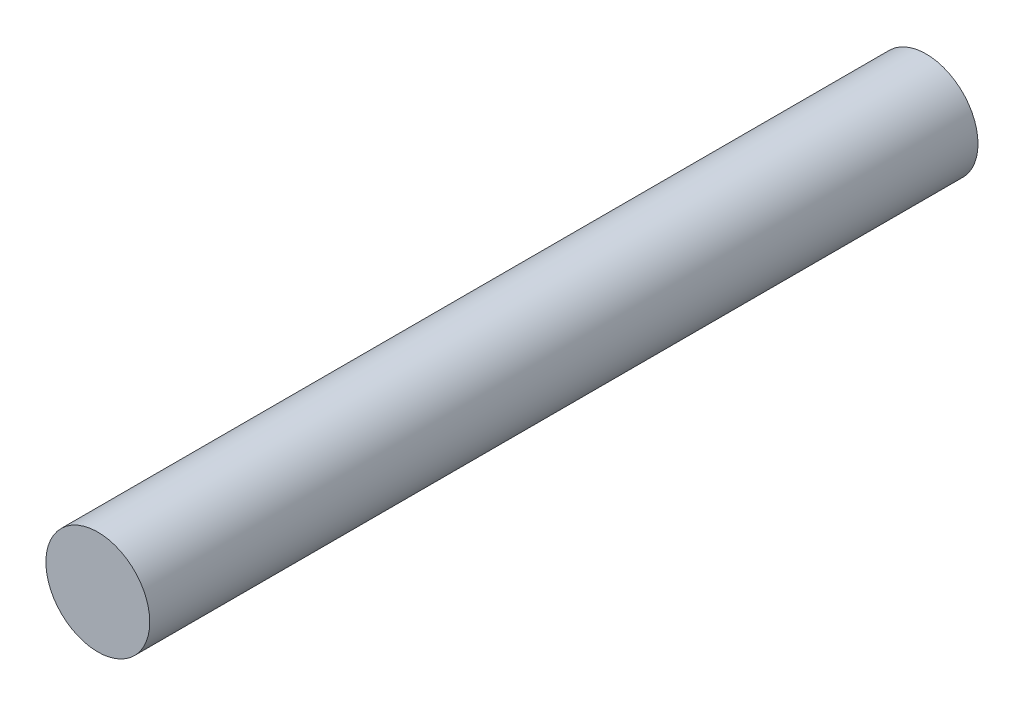
ISO-10303-21;
HEADER;
FILE_DESCRIPTION(('STEP AP214'),'2;1');
FILE_NAME('part.step','',(''),(''),'','','');
FILE_SCHEMA(('AUTOMOTIVE_DESIGN { 1 0 10303 214 1 1 1 1 }'));
ENDSEC;
DATA;
#1=APPLICATION_CONTEXT('core data for automotive mechanical design processes');
#2=APPLICATION_PROTOCOL_DEFINITION('international standard','automotive_design',2000,#1);
#3=PRODUCT_CONTEXT('',#1,'mechanical');
#4=PRODUCT('Part','Part','',(#3));
#5=PRODUCT_RELATED_PRODUCT_CATEGORY('part','',(#4));
#6=PRODUCT_DEFINITION_FORMATION('','',#4);
#7=PRODUCT_DEFINITION_CONTEXT('part definition',#1,'design');
#8=PRODUCT_DEFINITION('design','',#6,#7);
#9=PRODUCT_DEFINITION_SHAPE('','',#8);
#10=(LENGTH_UNIT() NAMED_UNIT(*) SI_UNIT(.MILLI.,.METRE.));
#11=(NAMED_UNIT(*) PLANE_ANGLE_UNIT() SI_UNIT($,.RADIAN.));
#12=(NAMED_UNIT(*) SI_UNIT($,.STERADIAN.) SOLID_ANGLE_UNIT());
#13=UNCERTAINTY_MEASURE_WITH_UNIT(LENGTH_MEASURE(1.E-05),#10,'distance_accuracy_value','');
#14=(GEOMETRIC_REPRESENTATION_CONTEXT(3) GLOBAL_UNCERTAINTY_ASSIGNED_CONTEXT((#13)) GLOBAL_UNIT_ASSIGNED_CONTEXT((#10,
#11,#12)) REPRESENTATION_CONTEXT('',''));
#15=CARTESIAN_POINT('',(0.,0.,0.));
#16=DIRECTION('',(0.,0.,1.));
#17=DIRECTION('',(1.,0.,0.));
#18=AXIS2_PLACEMENT_3D('',#15,#16,#17);
#19=CARTESIAN_POINT('',(0.,0.,15.95));
#20=DIRECTION('',(0.,0.,-1.));
#21=DIRECTION('',(-1.,0.,0.));
#22=AXIS2_PLACEMENT_3D('',#19,#20,#21);
#23=CYLINDRICAL_SURFACE('',#22,1.);
#24=CARTESIAN_POINT('',(0.,0.,15.95));
#25=DIRECTION('',(0.,0.,1.));
#26=DIRECTION('',(1.,0.,0.));
#27=AXIS2_PLACEMENT_3D('',#24,#25,#26);
#28=CIRCLE('',#27,1.);
#29=CARTESIAN_POINT('',(1.,0.,15.95));
#30=VERTEX_POINT('',#29);
#31=EDGE_CURVE('E10',#30,#30,#28,.T.);
#32=ORIENTED_EDGE('',*,*,#31,.F.);
#33=EDGE_LOOP('',(#32));
#34=FACE_BOUND('',#33,.T.);
#35=CARTESIAN_POINT('',(0.,0.,0.));
#36=DIRECTION('',(0.,0.,1.));
#37=DIRECTION('',(1.,0.,0.));
#38=AXIS2_PLACEMENT_3D('',#35,#36,#37);
#39=CIRCLE('',#38,1.);
#40=CARTESIAN_POINT('',(1.,0.,0.));
#41=VERTEX_POINT('',#40);
#42=EDGE_CURVE('E42',#41,#41,#39,.T.);
#43=ORIENTED_EDGE('',*,*,#42,.T.);
#44=EDGE_LOOP('',(#43));
#45=FACE_BOUND('',#44,.T.);
#46=ADVANCED_FACE('F39',(#34,#45),#23,.T.);
#47=CARTESIAN_POINT('',(0.,0.,15.95));
#48=DIRECTION('',(0.,0.,1.));
#49=DIRECTION('',(1.,0.,0.));
#50=AXIS2_PLACEMENT_3D('',#47,#48,#49);
#51=PLANE('',#50);
#52=ORIENTED_EDGE('',*,*,#31,.T.);
#53=EDGE_LOOP('',(#52));
#54=FACE_BOUND('',#53,.T.);
#55=ADVANCED_FACE('F54',(#54),#51,.T.);
#56=CARTESIAN_POINT('',(0.,0.,0.));
#57=DIRECTION('',(0.,0.,1.));
#58=DIRECTION('',(1.,0.,0.));
#59=AXIS2_PLACEMENT_3D('',#56,#57,#58);
#60=PLANE('',#59);
#61=ORIENTED_EDGE('',*,*,#42,.F.);
#62=EDGE_LOOP('',(#61));
#63=FACE_BOUND('',#62,.T.);
#64=ADVANCED_FACE('F52',(#63),#60,.F.);
#65=CLOSED_SHELL('',(#46,#55,#64));
#66=MANIFOLD_SOLID_BREP('B2',#65);
#67=ADVANCED_BREP_SHAPE_REPRESENTATION('',(#18,#66),#14);
#68=SHAPE_DEFINITION_REPRESENTATION(#9,#67);
ENDSEC;
END-ISO-10303-21;
